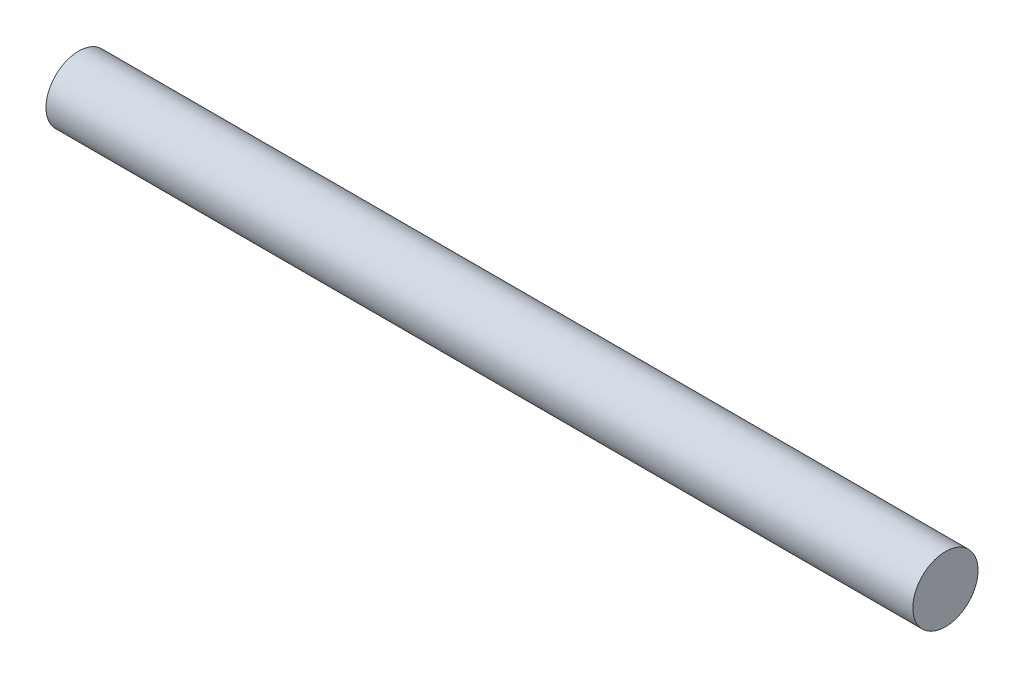
ISO-10303-21;
HEADER;
FILE_DESCRIPTION(('STEP AP214'),'2;1');
FILE_NAME('part.step','',(''),(''),'','','');
FILE_SCHEMA(('AUTOMOTIVE_DESIGN { 1 0 10303 214 1 1 1 1 }'));
ENDSEC;
DATA;
#1=APPLICATION_CONTEXT('core data for automotive mechanical design processes');
#2=APPLICATION_PROTOCOL_DEFINITION('international standard','automotive_design',2000,#1);
#3=PRODUCT_CONTEXT('',#1,'mechanical');
#4=PRODUCT('Part','Part','',(#3));
#5=PRODUCT_RELATED_PRODUCT_CATEGORY('part','',(#4));
#6=PRODUCT_DEFINITION_FORMATION('','',#4);
#7=PRODUCT_DEFINITION_CONTEXT('part definition',#1,'design');
#8=PRODUCT_DEFINITION('design','',#6,#7);
#9=PRODUCT_DEFINITION_SHAPE('','',#8);
#10=(LENGTH_UNIT() NAMED_UNIT(*) SI_UNIT(.MILLI.,.METRE.));
#11=(NAMED_UNIT(*) PLANE_ANGLE_UNIT() SI_UNIT($,.RADIAN.));
#12=(NAMED_UNIT(*) SI_UNIT($,.STERADIAN.) SOLID_ANGLE_UNIT());
#13=UNCERTAINTY_MEASURE_WITH_UNIT(LENGTH_MEASURE(1.E-05),#10,'distance_accuracy_value','');
#14=(GEOMETRIC_REPRESENTATION_CONTEXT(3) GLOBAL_UNCERTAINTY_ASSIGNED_CONTEXT((#13)) GLOBAL_UNIT_ASSIGNED_CONTEXT((#10,
#11,#12)) REPRESENTATION_CONTEXT('',''));
#15=CARTESIAN_POINT('',(0.,0.,0.));
#16=DIRECTION('',(0.,0.,1.));
#17=DIRECTION('',(1.,0.,0.));
#18=AXIS2_PLACEMENT_3D('',#15,#16,#17);
#19=CARTESIAN_POINT('',(66.4,0.,0.));
#20=DIRECTION('',(-1.,0.,0.));
#21=DIRECTION('',(0.,0.,1.));
#22=AXIS2_PLACEMENT_3D('',#19,#20,#21);
#23=CYLINDRICAL_SURFACE('',#22,2.5);
#24=CARTESIAN_POINT('',(66.4,0.,0.));
#25=DIRECTION('',(1.,0.,0.));
#26=DIRECTION('',(0.,0.,-1.));
#27=AXIS2_PLACEMENT_3D('',#24,#25,#26);
#28=CIRCLE('',#27,2.5);
#29=CARTESIAN_POINT('',(66.4,0.,2.5));
#30=VERTEX_POINT('',#29);
#31=EDGE_CURVE('E10',#30,#30,#28,.T.);
#32=CARTESIAN_POINT('',(0.,0.,0.));
#33=DIRECTION('',(1.,0.,0.));
#34=DIRECTION('',(0.,0.,-1.));
#35=AXIS2_PLACEMENT_3D('',#32,#33,#34);
#36=CIRCLE('',#35,2.5);
#37=CARTESIAN_POINT('',(0.,0.,2.5));
#38=VERTEX_POINT('',#37);
#39=EDGE_CURVE('E37',#38,#38,#36,.T.);
#40=CARTESIAN_POINT('',(66.4,0.,2.5));
#41=CARTESIAN_POINT('',(65.7083333333333,0.,2.5));
#42=CARTESIAN_POINT('',(65.0166666666667,0.,2.5));
#43=CARTESIAN_POINT('',(63.6333333333333,0.,2.5));
#44=CARTESIAN_POINT('',(62.9416666666667,0.,2.5));
#45=CARTESIAN_POINT('',(61.5583333333333,0.,2.5));
#46=CARTESIAN_POINT('',(60.8666666666667,0.,2.5));
#47=CARTESIAN_POINT('',(59.4833333333333,0.,2.5));
#48=CARTESIAN_POINT('',(58.7916666666667,0.,2.5));
#49=CARTESIAN_POINT('',(57.4083333333333,0.,2.5));
#50=CARTESIAN_POINT('',(56.7166666666667,0.,2.5));
#51=CARTESIAN_POINT('',(55.3333333333333,0.,2.5));
#52=CARTESIAN_POINT('',(54.6416666666667,0.,2.5));
#53=CARTESIAN_POINT('',(53.2583333333333,0.,2.5));
#54=CARTESIAN_POINT('',(52.5666666666667,0.,2.5));
#55=CARTESIAN_POINT('',(51.1833333333333,0.,2.5));
#56=CARTESIAN_POINT('',(50.4916666666667,0.,2.5));
#57=CARTESIAN_POINT('',(49.1083333333333,0.,2.5));
#58=CARTESIAN_POINT('',(48.4166666666667,0.,2.5));
#59=CARTESIAN_POINT('',(47.0333333333333,0.,2.5));
#60=CARTESIAN_POINT('',(46.3416666666667,0.,2.5));
#61=CARTESIAN_POINT('',(44.9583333333333,0.,2.5));
#62=CARTESIAN_POINT('',(44.2666666666667,0.,2.5));
#63=CARTESIAN_POINT('',(42.8833333333333,0.,2.5));
#64=CARTESIAN_POINT('',(42.1916666666667,0.,2.5));
#65=CARTESIAN_POINT('',(40.8083333333333,0.,2.5));
#66=CARTESIAN_POINT('',(40.1166666666667,0.,2.5));
#67=CARTESIAN_POINT('',(38.7333333333333,0.,2.5));
#68=CARTESIAN_POINT('',(38.0416666666667,0.,2.5));
#69=CARTESIAN_POINT('',(36.6583333333333,0.,2.5));
#70=CARTESIAN_POINT('',(35.9666666666667,0.,2.5));
#71=CARTESIAN_POINT('',(34.5833333333333,0.,2.5));
#72=CARTESIAN_POINT('',(33.8916666666667,0.,2.5));
#73=CARTESIAN_POINT('',(32.5083333333333,0.,2.5));
#74=CARTESIAN_POINT('',(31.8166666666667,0.,2.5));
#75=CARTESIAN_POINT('',(30.4333333333333,0.,2.5));
#76=CARTESIAN_POINT('',(29.7416666666667,0.,2.5));
#77=CARTESIAN_POINT('',(28.3583333333333,0.,2.5));
#78=CARTESIAN_POINT('',(27.6666666666667,0.,2.5));
#79=CARTESIAN_POINT('',(26.2833333333333,0.,2.5));
#80=CARTESIAN_POINT('',(25.5916666666667,0.,2.5));
#81=CARTESIAN_POINT('',(24.2083333333333,0.,2.5));
#82=CARTESIAN_POINT('',(23.5166666666667,0.,2.5));
#83=CARTESIAN_POINT('',(22.1333333333333,0.,2.5));
#84=CARTESIAN_POINT('',(21.4416666666667,0.,2.5));
#85=CARTESIAN_POINT('',(20.0583333333333,0.,2.5));
#86=CARTESIAN_POINT('',(19.3666666666667,0.,2.5));
#87=CARTESIAN_POINT('',(17.9833333333333,0.,2.5));
#88=CARTESIAN_POINT('',(17.2916666666667,0.,2.5));
#89=CARTESIAN_POINT('',(15.9083333333333,0.,2.5));
#90=CARTESIAN_POINT('',(15.2166666666667,0.,2.5));
#91=CARTESIAN_POINT('',(13.8333333333333,0.,2.5));
#92=CARTESIAN_POINT('',(13.1416666666667,0.,2.5));
#93=CARTESIAN_POINT('',(11.7583333333333,0.,2.5));
#94=CARTESIAN_POINT('',(11.0666666666667,0.,2.5));
#95=CARTESIAN_POINT('',(9.68333333333332,0.,2.5));
#96=CARTESIAN_POINT('',(8.99166666666665,0.,2.5));
#97=CARTESIAN_POINT('',(7.60833333333332,0.,2.5));
#98=CARTESIAN_POINT('',(6.91666666666665,0.,2.5));
#99=CARTESIAN_POINT('',(5.53333333333332,0.,2.5));
#100=CARTESIAN_POINT('',(4.84166666666665,0.,2.5));
#101=CARTESIAN_POINT('',(3.45833333333332,0.,2.5));
#102=CARTESIAN_POINT('',(2.76666666666666,0.,2.5));
#103=CARTESIAN_POINT('',(1.38333333333333,0.,2.5));
#104=CARTESIAN_POINT('',(0.691666666666664,0.,2.5));
#105=CARTESIAN_POINT('',(0.,0.,2.5));
#106=B_SPLINE_CURVE_WITH_KNOTS('',3,(#40,#41,#42,#43,#44,#45,#46,#47,#48,#49,#50,#51,#52,#53,
#54,#55,#56,#57,#58,#59,#60,#61,#62,#63,#64,#65,#66,#67,#68,#69,#70,#71,#72,#73,#74,#75,#76,#77,
#78,#79,#80,#81,#82,#83,#84,#85,#86,#87,#88,#89,#90,#91,#92,#93,#94,#95,#96,#97,#98,#99,#100,
#101,#102,#103,#104,#105),.UNSPECIFIED.,.F.,.F.,(4,2,2,2,2,2,2,2,2,2,2,2,2,2,2,2,2,2,2,2,2,2,2,
2,2,2,2,2,2,2,2,2,4),(0.,2.07500000000001,4.15000000000001,6.22500000000001,8.30000000000001,
10.375,12.45,14.525,16.6,18.675,20.75,22.825,24.9,26.975,29.05,31.125,33.2,35.275,37.35,39.425,
41.5,43.575,45.65,47.725,49.8,51.875,53.95,56.025,58.1,60.175,62.25,64.325,66.4),.UNSPECIFIED.);
#107=EDGE_CURVE('BSEAM34',#30,#38,#106,.T.);
#108=ORIENTED_EDGE('',*,*,#31,.F.);
#109=ORIENTED_EDGE('',*,*,#39,.T.);
#110=ORIENTED_EDGE('',*,*,#107,.T.);
#111=ORIENTED_EDGE('',*,*,#107,.F.);
#112=EDGE_LOOP('',(#108,#110,#109,#111));
#113=FACE_BOUND('',#112,.T.);
#114=ADVANCED_FACE('F34',(#113),#23,.T.);
#115=CARTESIAN_POINT('',(66.4,0.,0.));
#116=DIRECTION('',(1.,0.,0.));
#117=DIRECTION('',(0.,0.,-1.));
#118=AXIS2_PLACEMENT_3D('',#115,#116,#117);
#119=PLANE('',#118);
#120=ORIENTED_EDGE('',*,*,#31,.T.);
#121=EDGE_LOOP('',(#120));
#122=FACE_BOUND('',#121,.T.);
#123=ADVANCED_FACE('F49',(#122),#119,.T.);
#124=CARTESIAN_POINT('',(0.,0.,0.));
#125=DIRECTION('',(1.,0.,0.));
#126=DIRECTION('',(0.,0.,-1.));
#127=AXIS2_PLACEMENT_3D('',#124,#125,#126);
#128=PLANE('',#127);
#129=ORIENTED_EDGE('',*,*,#39,.F.);
#130=EDGE_LOOP('',(#129));
#131=FACE_BOUND('',#130,.T.);
#132=ADVANCED_FACE('F47',(#131),#128,.F.);
#133=CLOSED_SHELL('',(#114,#123,#132));
#134=MANIFOLD_SOLID_BREP('B2',#133);
#135=ADVANCED_BREP_SHAPE_REPRESENTATION('',(#18,#134),#14);
#136=SHAPE_DEFINITION_REPRESENTATION(#9,#135);
ENDSEC;
END-ISO-10303-21;
